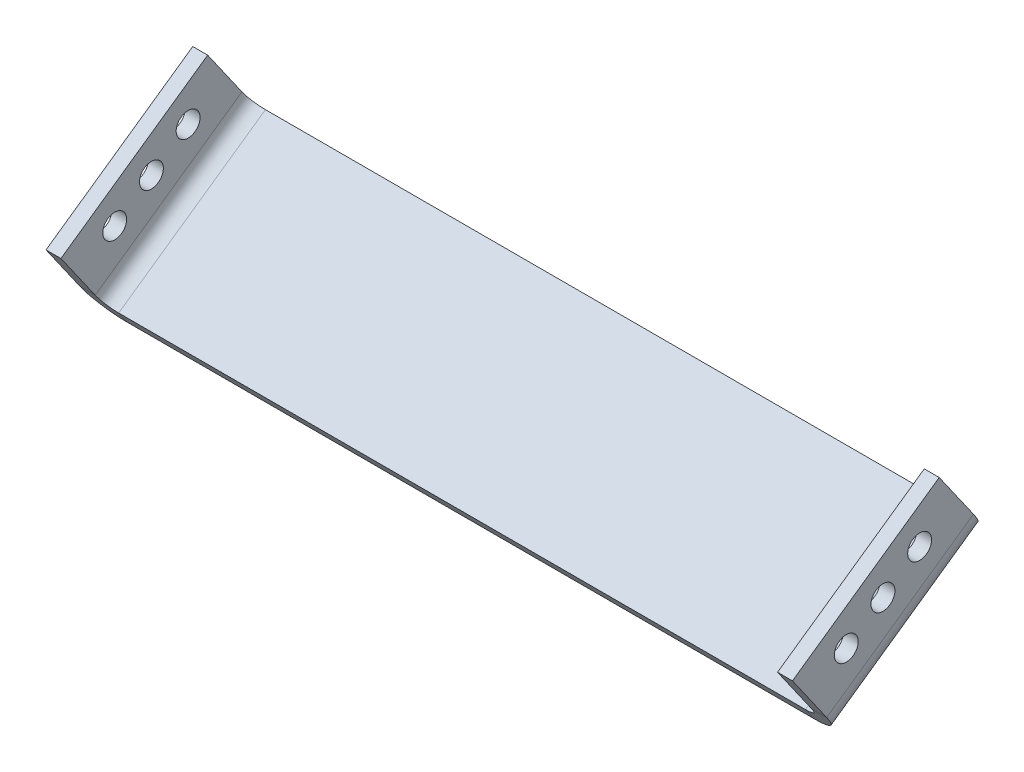
ISO-10303-21;
HEADER;
FILE_DESCRIPTION(('STEP AP214'),'2;1');
FILE_NAME('part.step','',(''),(''),'','','');
FILE_SCHEMA(('AUTOMOTIVE_DESIGN { 1 0 10303 214 1 1 1 1 }'));
ENDSEC;
DATA;
#1=APPLICATION_CONTEXT('core data for automotive mechanical design processes');
#2=APPLICATION_PROTOCOL_DEFINITION('international standard','automotive_design',2000,#1);
#3=PRODUCT_CONTEXT('',#1,'mechanical');
#4=PRODUCT('Part','Part','',(#3));
#5=PRODUCT_RELATED_PRODUCT_CATEGORY('part','',(#4));
#6=PRODUCT_DEFINITION_FORMATION('','',#4);
#7=PRODUCT_DEFINITION_CONTEXT('part definition',#1,'design');
#8=PRODUCT_DEFINITION('design','',#6,#7);
#9=PRODUCT_DEFINITION_SHAPE('','',#8);
#10=(LENGTH_UNIT() NAMED_UNIT(*) SI_UNIT(.MILLI.,.METRE.));
#11=(NAMED_UNIT(*) PLANE_ANGLE_UNIT() SI_UNIT($,.RADIAN.));
#12=(NAMED_UNIT(*) SI_UNIT($,.STERADIAN.) SOLID_ANGLE_UNIT());
#13=UNCERTAINTY_MEASURE_WITH_UNIT(LENGTH_MEASURE(1.E-05),#10,'distance_accuracy_value','');
#14=(GEOMETRIC_REPRESENTATION_CONTEXT(3) GLOBAL_UNCERTAINTY_ASSIGNED_CONTEXT((#13)) GLOBAL_UNIT_ASSIGNED_CONTEXT((#10,
#11,#12)) REPRESENTATION_CONTEXT('',''));
#15=CARTESIAN_POINT('',(0.,0.,0.));
#16=DIRECTION('',(0.,0.,1.));
#17=DIRECTION('',(1.,0.,0.));
#18=AXIS2_PLACEMENT_3D('',#15,#16,#17);
#19=CARTESIAN_POINT('',(158.75,76.8527751929984,82.6284773456917));
#20=DIRECTION('',(0.,0.819152044288992,0.573576436351046));
#21=DIRECTION('',(0.,0.573576436351046,-0.819152044288992));
#22=AXIS2_PLACEMENT_3D('',#19,#20,#21);
#23=PLANE('',#22);
#24=DIRECTION('',(0.,-0.573576436351046,0.819152044288992));
#25=VECTOR('',#24,1.);
#26=CARTESIAN_POINT('',(152.4,54.9995129680235,113.838170233102));
#27=LINE('',#26,#25);
#28=CARTESIAN_POINT('',(152.4,54.9995129680235,113.838170233102));
#29=VERTEX_POINT('',#28);
#30=CARTESIAN_POINT('',(152.4,76.8527751929984,82.6284773456917));
#31=VERTEX_POINT('',#30);
#32=EDGE_CURVE('E180',#29,#31,#27,.F.);
#33=ORIENTED_EDGE('',*,*,#32,.F.);
#34=DIRECTION('',(-1.,0.,0.));
#35=VECTOR('',#34,1.);
#36=CARTESIAN_POINT('',(158.75,54.9995129680235,113.838170233102));
#37=LINE('',#36,#35);
#38=CARTESIAN_POINT('',(6.34999999999999,54.9995129680235,113.838170233102));
#39=VERTEX_POINT('',#38);
#40=EDGE_CURVE('E48',#29,#39,#37,.T.);
#41=ORIENTED_EDGE('',*,*,#40,.T.);
#42=DIRECTION('',(0.,0.573576436351046,-0.819152044288992));
#43=VECTOR('',#42,1.);
#44=CARTESIAN_POINT('',(6.34999999999999,76.8527751929984,82.6284773456917));
#45=LINE('',#44,#43);
#46=CARTESIAN_POINT('',(6.34999999999999,76.8527751929984,82.6284773456917));
#47=VERTEX_POINT('',#46);
#48=EDGE_CURVE('E231',#47,#39,#45,.F.);
#49=ORIENTED_EDGE('',*,*,#48,.F.);
#50=DIRECTION('',(-1.,0.,0.));
#51=VECTOR('',#50,1.);
#52=CARTESIAN_POINT('',(158.75,76.8527751929984,82.6284773456917));
#53=LINE('',#52,#51);
#54=EDGE_CURVE('E11',#31,#47,#53,.T.);
#55=ORIENTED_EDGE('',*,*,#54,.F.);
#56=EDGE_LOOP('',(#33,#41,#49,#55));
#57=FACE_BOUND('',#56,.T.);
#58=ADVANCED_FACE('F39',(#57),#23,.F.);
#59=CARTESIAN_POINT('',(158.75,79.453582933616,84.4495825311063));
#60=DIRECTION('',(0.,0.819152044288992,0.573576436351046));
#61=DIRECTION('',(0.,0.573576436351046,-0.819152044288992));
#62=AXIS2_PLACEMENT_3D('',#59,#60,#61);
#63=PLANE('',#62);
#64=DIRECTION('',(1.,0.,0.));
#65=VECTOR('',#64,1.);
#66=CARTESIAN_POINT('',(158.75,79.453582933616,84.4495825311063));
#67=LINE('',#66,#65);
#68=CARTESIAN_POINT('',(152.4,79.4535829336159,84.4495825311062));
#69=VERTEX_POINT('',#68);
#70=CARTESIAN_POINT('',(6.34999999999999,79.453582933616,84.4495825311063));
#71=VERTEX_POINT('',#70);
#72=EDGE_CURVE('E250',#69,#71,#67,.F.);
#73=ORIENTED_EDGE('',*,*,#72,.T.);
#74=DIRECTION('',(0.,0.573576436351046,-0.819152044288992));
#75=VECTOR('',#74,1.);
#76=CARTESIAN_POINT('',(6.34999999999999,79.453582933616,84.4495825311063));
#77=LINE('',#76,#75);
#78=CARTESIAN_POINT('',(6.34999999999999,57.6003207086411,115.659275418517));
#79=VERTEX_POINT('',#78);
#80=EDGE_CURVE('E241',#71,#79,#77,.F.);
#81=ORIENTED_EDGE('',*,*,#80,.T.);
#82=DIRECTION('',(1.,0.,0.));
#83=VECTOR('',#82,1.);
#84=CARTESIAN_POINT('',(158.75,57.6003207086411,115.659275418517));
#85=LINE('',#84,#83);
#86=CARTESIAN_POINT('',(152.4,57.600320708641,115.659275418517));
#87=VERTEX_POINT('',#86);
#88=EDGE_CURVE('E247',#87,#79,#85,.F.);
#89=ORIENTED_EDGE('',*,*,#88,.F.);
#90=DIRECTION('',(0.,-0.573576436351046,0.819152044288992));
#91=VECTOR('',#90,1.);
#92=CARTESIAN_POINT('',(152.4,57.600320708641,115.659275418517));
#93=LINE('',#92,#91);
#94=EDGE_CURVE('E191',#87,#69,#93,.F.);
#95=ORIENTED_EDGE('',*,*,#94,.T.);
#96=EDGE_LOOP('',(#73,#81,#89,#95));
#97=FACE_BOUND('',#96,.T.);
#98=ADVANCED_FACE('F333',(#97),#63,.T.);
#99=CARTESIAN_POINT('',(158.75,54.9995129680235,113.838170233102));
#100=DIRECTION('',(0.,-0.573576436351046,0.819152044288992));
#101=DIRECTION('',(-1.,0.,0.));
#102=AXIS2_PLACEMENT_3D('',#99,#100,#101);
#103=PLANE('',#102);
#104=ORIENTED_EDGE('',*,*,#88,.T.);
#105=DIRECTION('',(0.,-0.819152044288989,-0.573576436351051));
#106=VECTOR('',#105,1.);
#107=CARTESIAN_POINT('',(6.34999999999999,57.6003207086411,115.659275418517));
#108=LINE('',#107,#106);
#109=EDGE_CURVE('E245',#79,#39,#108,.T.);
#110=ORIENTED_EDGE('',*,*,#109,.T.);
#111=ORIENTED_EDGE('',*,*,#40,.F.);
#112=DIRECTION('',(0.,-0.819152044288991,-0.573576436351046));
#113=VECTOR('',#112,1.);
#114=CARTESIAN_POINT('',(152.4,57.600320708641,115.659275418517));
#115=LINE('',#114,#113);
#116=EDGE_CURVE('E186',#87,#29,#115,.T.);
#117=ORIENTED_EDGE('',*,*,#116,.F.);
#118=EDGE_LOOP('',(#104,#110,#111,#117));
#119=FACE_BOUND('',#118,.T.);
#120=ADVANCED_FACE('F41',(#119),#103,.T.);
#121=CARTESIAN_POINT('',(158.75,76.8527751929984,82.6284773456917));
#122=DIRECTION('',(0.,-0.573576436351046,0.819152044288992));
#123=DIRECTION('',(-1.,0.,0.));
#124=AXIS2_PLACEMENT_3D('',#121,#122,#123);
#125=PLANE('',#124);
#126=DIRECTION('',(0.,-0.819152044288992,-0.573576436351046));
#127=VECTOR('',#126,1.);
#128=CARTESIAN_POINT('',(152.4,79.4535829336159,84.4495825311062));
#129=LINE('',#128,#127);
#130=EDGE_CURVE('E195',#69,#31,#129,.T.);
#131=ORIENTED_EDGE('',*,*,#130,.T.);
#132=ORIENTED_EDGE('',*,*,#54,.T.);
#133=DIRECTION('',(0.,-0.819152044288992,-0.573576436351046));
#134=VECTOR('',#133,1.);
#135=CARTESIAN_POINT('',(6.34999999999999,79.4535829336159,84.4495825311063));
#136=LINE('',#135,#134);
#137=EDGE_CURVE('E236',#71,#47,#136,.T.);
#138=ORIENTED_EDGE('',*,*,#137,.F.);
#139=ORIENTED_EDGE('',*,*,#72,.F.);
#140=EDGE_LOOP('',(#131,#132,#138,#139));
#141=FACE_BOUND('',#140,.T.);
#142=ADVANCED_FACE('F323',(#141),#125,.F.);
#143=CARTESIAN_POINT('',(6.34999999999999,60.2011284492586,117.480380603931));
#144=DIRECTION('',(0.,-0.573576436351046,0.819152044288992));
#145=DIRECTION('',(0.,0.819152044288992,0.573576436351046));
#146=AXIS2_PLACEMENT_3D('',#143,#144,#145);
#147=PLANE('',#146);
#148=DIRECTION('',(1.,0.,0.));
#149=VECTOR('',#148,1.);
#150=CARTESIAN_POINT('',(0.,60.2011284492586,117.480380603931));
#151=LINE('',#150,#149);
#152=CARTESIAN_POINT('',(3.17499999999999,60.2011284492586,117.480380603931));
#153=VERTEX_POINT('',#152);
#154=CARTESIAN_POINT('',(0.,60.2011284492586,117.480380603931));
#155=VERTEX_POINT('',#154);
#156=EDGE_CURVE('E198',#153,#155,#151,.F.);
#157=ORIENTED_EDGE('',*,*,#156,.T.);
#158=CARTESIAN_POINT('',(6.34999999999999,60.2011284492586,117.480380603931));
#159=DIRECTION('',(0.,-0.573576436351046,0.819152044288992));
#160=DIRECTION('',(0.,-0.819152044288992,-0.573576436351046));
#161=AXIS2_PLACEMENT_3D('',#158,#159,#160);
#162=CIRCLE('',#161,6.35);
#163=EDGE_CURVE('E64',#39,#155,#162,.F.);
#164=ORIENTED_EDGE('',*,*,#163,.F.);
#165=ORIENTED_EDGE('',*,*,#109,.F.);
#166=CARTESIAN_POINT('',(6.34999999999999,60.2011284492586,117.480380603931));
#167=DIRECTION('',(0.,-0.573576436351046,0.819152044288992));
#168=DIRECTION('',(0.,-0.819152044288992,-0.573576436351046));
#169=AXIS2_PLACEMENT_3D('',#166,#167,#168);
#170=CIRCLE('',#169,3.175);
#171=EDGE_CURVE('E238',#79,#153,#170,.F.);
#172=ORIENTED_EDGE('',*,*,#171,.T.);
#173=EDGE_LOOP('',(#157,#164,#165,#172));
#174=FACE_BOUND('',#173,.T.);
#175=ADVANCED_FACE('F309',(#174),#147,.T.);
#176=CARTESIAN_POINT('',(6.34999999999999,82.0543906742335,86.2706877165209));
#177=DIRECTION('',(0.,-0.573576436351046,0.819152044288992));
#178=DIRECTION('',(0.,0.819152044288992,0.573576436351046));
#179=AXIS2_PLACEMENT_3D('',#176,#177,#178);
#180=PLANE('',#179);
#181=CARTESIAN_POINT('',(6.34999999999999,82.0543906742335,86.2706877165209));
#182=DIRECTION('',(0.,-0.573576436351046,0.819152044288992));
#183=DIRECTION('',(0.,-0.819152044288992,-0.573576436351046));
#184=AXIS2_PLACEMENT_3D('',#181,#182,#183);
#185=CIRCLE('',#184,3.175);
#186=CARTESIAN_POINT('',(3.17499999999999,82.0543906742335,86.2706877165209));
#187=VERTEX_POINT('',#186);
#188=EDGE_CURVE('E56',#187,#71,#185,.T.);
#189=ORIENTED_EDGE('',*,*,#188,.T.);
#190=ORIENTED_EDGE('',*,*,#137,.T.);
#191=CARTESIAN_POINT('',(6.34999999999999,82.0543906742335,86.2706877165209));
#192=DIRECTION('',(0.,-0.573576436351046,0.819152044288992));
#193=DIRECTION('',(0.,-0.819152044288992,-0.573576436351046));
#194=AXIS2_PLACEMENT_3D('',#191,#192,#193);
#195=CIRCLE('',#194,6.35);
#196=CARTESIAN_POINT('',(0.,82.0543906742335,86.2706877165209));
#197=VERTEX_POINT('',#196);
#198=EDGE_CURVE('E234',#197,#47,#195,.T.);
#199=ORIENTED_EDGE('',*,*,#198,.F.);
#200=DIRECTION('',(1.,0.,0.));
#201=VECTOR('',#200,1.);
#202=CARTESIAN_POINT('',(3.17499999999999,82.0543906742335,86.2706877165209));
#203=LINE('',#202,#201);
#204=EDGE_CURVE('E224',#187,#197,#203,.F.);
#205=ORIENTED_EDGE('',*,*,#204,.F.);
#206=EDGE_LOOP('',(#189,#190,#199,#205));
#207=FACE_BOUND('',#206,.T.);
#208=ADVANCED_FACE('F318',(#207),#180,.F.);
#209=CARTESIAN_POINT('',(6.34999999999999,82.0543906742335,86.2706877165208));
#210=DIRECTION('',(0.,0.573576436351046,-0.819152044288992));
#211=DIRECTION('',(-1.,0.,0.));
#212=AXIS2_PLACEMENT_3D('',#209,#210,#211);
#213=CYLINDRICAL_SURFACE('',#212,6.35);
#214=ORIENTED_EDGE('',*,*,#48,.T.);
#215=ORIENTED_EDGE('',*,*,#163,.T.);
#216=DIRECTION('',(0.,0.573576436351047,-0.819152044288991));
#217=VECTOR('',#216,1.);
#218=CARTESIAN_POINT('',(0.,60.2011284492586,117.480380603931));
#219=LINE('',#218,#217);
#220=EDGE_CURVE('E221',#197,#155,#219,.F.);
#221=ORIENTED_EDGE('',*,*,#220,.F.);
#222=ORIENTED_EDGE('',*,*,#198,.T.);
#223=EDGE_LOOP('',(#214,#215,#221,#222));
#224=FACE_BOUND('',#223,.T.);
#225=ADVANCED_FACE('F306',(#224),#213,.T.);
#226=CARTESIAN_POINT('',(6.34999999999999,82.0543906742335,86.2706877165208));
#227=DIRECTION('',(0.,0.573576436351046,-0.819152044288992));
#228=DIRECTION('',(-1.,0.,0.));
#229=AXIS2_PLACEMENT_3D('',#226,#227,#228);
#230=CYLINDRICAL_SURFACE('',#229,3.175);
#231=ORIENTED_EDGE('',*,*,#80,.F.);
#232=ORIENTED_EDGE('',*,*,#188,.F.);
#233=DIRECTION('',(0.,0.573576436351047,-0.819152044288991));
#234=VECTOR('',#233,1.);
#235=CARTESIAN_POINT('',(3.17499999999999,60.2011284492586,117.480380603931));
#236=LINE('',#235,#234);
#237=EDGE_CURVE('E227',#153,#187,#236,.T.);
#238=ORIENTED_EDGE('',*,*,#237,.F.);
#239=ORIENTED_EDGE('',*,*,#171,.F.);
#240=EDGE_LOOP('',(#231,#232,#238,#239));
#241=FACE_BOUND('',#240,.T.);
#242=ADVANCED_FACE('F335',(#241),#230,.F.);
#243=CARTESIAN_POINT('',(0.,92.4576216367036,93.5551084581792));
#244=DIRECTION('',(0.,-0.573576436351051,0.819152044288988));
#245=DIRECTION('',(0.,0.819152044288988,0.573576436351051));
#246=AXIS2_PLACEMENT_3D('',#243,#244,#245);
#247=PLANE('',#246);
#248=ORIENTED_EDGE('',*,*,#204,.T.);
#249=DIRECTION('',(0.,0.819152044288988,0.573576436351051));
#250=VECTOR('',#249,1.);
#251=CARTESIAN_POINT('',(3.98552718605672E-13,-13.5388962110039,19.3355476372333));
#252=LINE('',#251,#250);
#253=CARTESIAN_POINT('',(0.,92.4576216367036,93.5551084581792));
#254=VERTEX_POINT('',#253);
#255=EDGE_CURVE('E211',#197,#254,#252,.T.);
#256=ORIENTED_EDGE('',*,*,#255,.T.);
#257=DIRECTION('',(1.,0.,0.));
#258=VECTOR('',#257,1.);
#259=CARTESIAN_POINT('',(0.,92.4576216367036,93.5551084581792));
#260=LINE('',#259,#258);
#261=CARTESIAN_POINT('',(3.17499999999994,92.4576216367036,93.5551084581792));
#262=VERTEX_POINT('',#261);
#263=EDGE_CURVE('E201',#254,#262,#260,.T.);
#264=ORIENTED_EDGE('',*,*,#263,.T.);
#265=DIRECTION('',(0.,-0.819152044288988,-0.573576436351051));
#266=VECTOR('',#265,1.);
#267=CARTESIAN_POINT('',(3.17499999999994,92.4576216367036,93.5551084581792));
#268=LINE('',#267,#266);
#269=EDGE_CURVE('E218',#187,#262,#268,.F.);
#270=ORIENTED_EDGE('',*,*,#269,.F.);
#271=EDGE_LOOP('',(#248,#256,#264,#270));
#272=FACE_BOUND('',#271,.T.);
#273=ADVANCED_FACE('F316',(#272),#247,.F.);
#274=CARTESIAN_POINT('',(0.,57.6003207086411,115.659275418517));
#275=DIRECTION('',(0.,0.573576436351052,-0.819152044288987));
#276=DIRECTION('',(0.,-0.819152044288988,-0.573576436351052));
#277=AXIS2_PLACEMENT_3D('',#274,#275,#276);
#278=PLANE('',#277);
#279=ORIENTED_EDGE('',*,*,#156,.F.);
#280=DIRECTION('',(0.,0.819152044288988,0.573576436351052));
#281=VECTOR('',#280,1.);
#282=CARTESIAN_POINT('',(3.175,57.6003207086411,115.659275418517));
#283=LINE('',#282,#281);
#284=CARTESIAN_POINT('',(3.17499999999994,70.6043594117288,124.76480134559));
#285=VERTEX_POINT('',#284);
#286=EDGE_CURVE('E214',#285,#153,#283,.F.);
#287=ORIENTED_EDGE('',*,*,#286,.F.);
#288=DIRECTION('',(1.,0.,0.));
#289=VECTOR('',#288,1.);
#290=CARTESIAN_POINT('',(0.,70.6043594117288,124.76480134559));
#291=LINE('',#290,#289);
#292=CARTESIAN_POINT('',(0.,70.6043594117288,124.76480134559));
#293=VERTEX_POINT('',#292);
#294=EDGE_CURVE('E204',#293,#285,#291,.T.);
#295=ORIENTED_EDGE('',*,*,#294,.F.);
#296=DIRECTION('',(0.,-0.819152044288988,-0.573576436351052));
#297=VECTOR('',#296,1.);
#298=CARTESIAN_POINT('',(3.98552718605673E-13,-35.392158435979,50.5452405246437));
#299=LINE('',#298,#297);
#300=EDGE_CURVE('E207',#293,#155,#299,.T.);
#301=ORIENTED_EDGE('',*,*,#300,.T.);
#302=EDGE_LOOP('',(#279,#287,#295,#301));
#303=FACE_BOUND('',#302,.T.);
#304=ADVANCED_FACE('F299',(#303),#278,.F.);
#305=CARTESIAN_POINT('',(3.98552718605671E-13,0.,0.));
#306=DIRECTION('',(1.,0.,0.));
#307=DIRECTION('',(0.,1.,0.));
#308=AXIS2_PLACEMENT_3D('',#305,#306,#307);
#309=PLANE('',#308);
#310=CARTESIAN_POINT('',(-1.38777878078145E-13,76.3293750429818,105.517744531056));
#311=DIRECTION('',(-1.,0.,0.));
#312=DIRECTION('',(0.,1.,0.));
#313=AXIS2_PLACEMENT_3D('',#310,#311,#312);
#314=CIRCLE('',#313,2.53999999999999);
#315=CARTESIAN_POINT('',(-1.31502346396237E-13,78.8693750429818,105.517744531056));
#316=VERTEX_POINT('',#315);
#317=EDGE_CURVE('E651',#316,#316,#314,.T.);
#318=ORIENTED_EDGE('',*,*,#317,.F.);
#319=EDGE_LOOP('',(#318));
#320=FACE_BOUND('',#319,.T.);
#321=CARTESIAN_POINT('',(-1.38777878078145E-13,70.8660594867381,113.320167752908));
#322=DIRECTION('',(-1.,0.,0.));
#323=DIRECTION('',(0.,1.,0.));
#324=AXIS2_PLACEMENT_3D('',#321,#322,#323);
#325=CIRCLE('',#324,2.5400000000001);
#326=CARTESIAN_POINT('',(-1.31502346396237E-13,73.4060594867382,113.320167752908));
#327=VERTEX_POINT('',#326);
#328=EDGE_CURVE('E262',#327,#327,#325,.T.);
#329=ORIENTED_EDGE('',*,*,#328,.F.);
#330=EDGE_LOOP('',(#329));
#331=FACE_BOUND('',#330,.T.);
#332=CARTESIAN_POINT('',(-1.38777878078145E-13,81.7926905992255,97.7153213092031));
#333=DIRECTION('',(-1.,0.,0.));
#334=DIRECTION('',(0.,1.,0.));
#335=AXIS2_PLACEMENT_3D('',#332,#333,#334);
#336=CIRCLE('',#335,2.53999999999999);
#337=CARTESIAN_POINT('',(-1.31502346396237E-13,84.3326905992255,97.7153213092031));
#338=VERTEX_POINT('',#337);
#339=EDGE_CURVE('E258',#338,#338,#336,.T.);
#340=ORIENTED_EDGE('',*,*,#339,.F.);
#341=EDGE_LOOP('',(#340));
#342=FACE_BOUND('',#341,.T.);
#343=ORIENTED_EDGE('',*,*,#220,.T.);
#344=ORIENTED_EDGE('',*,*,#300,.F.);
#345=DIRECTION('',(0.,-0.573576436351046,0.819152044288992));
#346=VECTOR('',#345,1.);
#347=CARTESIAN_POINT('',(0.,105.996517847708,74.2195608209452));
#348=LINE('',#347,#346);
#349=EDGE_CURVE('E209',#254,#293,#348,.T.);
#350=ORIENTED_EDGE('',*,*,#349,.F.);
#351=ORIENTED_EDGE('',*,*,#255,.F.);
#352=EDGE_LOOP('',(#343,#344,#350,#351));
#353=FACE_BOUND('',#352,.T.);
#354=ADVANCED_FACE('F296',(#320,#331,#342,#353),#309,.F.);
#355=CARTESIAN_POINT('',(3.1750000000004,0.,0.));
#356=DIRECTION('',(1.,0.,0.));
#357=DIRECTION('',(0.,1.,0.));
#358=AXIS2_PLACEMENT_3D('',#355,#356,#357);
#359=PLANE('',#358);
#360=CARTESIAN_POINT('',(3.17499999999997,76.3293750429818,105.517744531056));
#361=DIRECTION('',(-1.,0.,0.));
#362=DIRECTION('',(0.,1.,0.));
#363=AXIS2_PLACEMENT_3D('',#360,#361,#362);
#364=CIRCLE('',#363,2.53999999999999);
#365=CARTESIAN_POINT('',(3.17499999999996,78.8693750429817,105.517744531056));
#366=VERTEX_POINT('',#365);
#367=EDGE_CURVE('E274',#366,#366,#364,.T.);
#368=ORIENTED_EDGE('',*,*,#367,.T.);
#369=EDGE_LOOP('',(#368));
#370=FACE_BOUND('',#369,.T.);
#371=CARTESIAN_POINT('',(3.17499999999997,70.8660594867381,113.320167752908));
#372=DIRECTION('',(-1.,0.,0.));
#373=DIRECTION('',(0.,1.,0.));
#374=AXIS2_PLACEMENT_3D('',#371,#372,#373);
#375=CIRCLE('',#374,2.5400000000001);
#376=CARTESIAN_POINT('',(3.17499999999996,73.4060594867382,113.320167752908));
#377=VERTEX_POINT('',#376);
#378=EDGE_CURVE('E261',#377,#377,#375,.T.);
#379=ORIENTED_EDGE('',*,*,#378,.T.);
#380=EDGE_LOOP('',(#379));
#381=FACE_BOUND('',#380,.T.);
#382=CARTESIAN_POINT('',(3.17499999999997,81.7926905992255,97.7153213092031));
#383=DIRECTION('',(-1.,0.,0.));
#384=DIRECTION('',(0.,1.,0.));
#385=AXIS2_PLACEMENT_3D('',#382,#383,#384);
#386=CIRCLE('',#385,2.53999999999999);
#387=CARTESIAN_POINT('',(3.17499999999996,84.3326905992255,97.7153213092031));
#388=VERTEX_POINT('',#387);
#389=EDGE_CURVE('E179',#388,#388,#386,.T.);
#390=ORIENTED_EDGE('',*,*,#389,.T.);
#391=EDGE_LOOP('',(#390));
#392=FACE_BOUND('',#391,.T.);
#393=ORIENTED_EDGE('',*,*,#269,.T.);
#394=DIRECTION('',(0.,0.573576436351046,-0.819152044288992));
#395=VECTOR('',#394,1.);
#396=CARTESIAN_POINT('',(3.17499999999994,70.6043594117288,124.76480134559));
#397=LINE('',#396,#395);
#398=EDGE_CURVE('E216',#262,#285,#397,.F.);
#399=ORIENTED_EDGE('',*,*,#398,.T.);
#400=ORIENTED_EDGE('',*,*,#286,.T.);
#401=ORIENTED_EDGE('',*,*,#237,.T.);
#402=EDGE_LOOP('',(#393,#399,#400,#401));
#403=FACE_BOUND('',#402,.T.);
#404=ADVANCED_FACE('F285',(#370,#381,#392,#403),#359,.T.);
#405=CARTESIAN_POINT('',(0.,70.6043594117288,124.76480134559));
#406=DIRECTION('',(0.,-0.819152044288992,-0.573576436351046));
#407=DIRECTION('',(0.,-0.573576436351046,0.819152044288992));
#408=AXIS2_PLACEMENT_3D('',#405,#406,#407);
#409=PLANE('',#408);
#410=ORIENTED_EDGE('',*,*,#398,.F.);
#411=ORIENTED_EDGE('',*,*,#263,.F.);
#412=ORIENTED_EDGE('',*,*,#349,.T.);
#413=ORIENTED_EDGE('',*,*,#294,.T.);
#414=EDGE_LOOP('',(#410,#411,#412,#413));
#415=FACE_BOUND('',#414,.T.);
#416=ADVANCED_FACE('F313',(#415),#409,.F.);
#417=CARTESIAN_POINT('',(152.4,82.0543906742335,86.2706877165208));
#418=DIRECTION('',(0.,0.573576436351046,-0.819152044288992));
#419=DIRECTION('',(0.,-0.819152044288992,-0.573576436351046));
#420=AXIS2_PLACEMENT_3D('',#417,#418,#419);
#421=PLANE('',#420);
#422=DIRECTION('',(-1.,0.,0.));
#423=VECTOR('',#422,1.);
#424=CARTESIAN_POINT('',(158.75,82.0543906742334,86.2706877165209));
#425=LINE('',#424,#423);
#426=CARTESIAN_POINT('',(155.575,82.0543906742335,86.2706877165208));
#427=VERTEX_POINT('',#426);
#428=CARTESIAN_POINT('',(158.75,82.0543906742335,86.2706877165208));
#429=VERTEX_POINT('',#428);
#430=EDGE_CURVE('E176',#427,#429,#425,.F.);
#431=ORIENTED_EDGE('',*,*,#430,.T.);
#432=CARTESIAN_POINT('',(152.4,82.0543906742335,86.2706877165208));
#433=DIRECTION('',(0.,0.573576436351046,-0.819152044288992));
#434=DIRECTION('',(0.,0.819152044288992,0.573576436351046));
#435=AXIS2_PLACEMENT_3D('',#432,#433,#434);
#436=CIRCLE('',#435,6.35000000000001);
#437=EDGE_CURVE('E183',#31,#429,#436,.F.);
#438=ORIENTED_EDGE('',*,*,#437,.F.);
#439=ORIENTED_EDGE('',*,*,#130,.F.);
#440=CARTESIAN_POINT('',(152.4,82.0543906742335,86.2706877165208));
#441=DIRECTION('',(0.,0.573576436351046,-0.819152044288992));
#442=DIRECTION('',(0.,0.819152044288992,0.573576436351046));
#443=AXIS2_PLACEMENT_3D('',#440,#441,#442);
#444=CIRCLE('',#443,3.17500000000001);
#445=EDGE_CURVE('E188',#69,#427,#444,.F.);
#446=ORIENTED_EDGE('',*,*,#445,.T.);
#447=EDGE_LOOP('',(#431,#438,#439,#446));
#448=FACE_BOUND('',#447,.T.);
#449=ADVANCED_FACE('F343',(#448),#421,.T.);
#450=CARTESIAN_POINT('',(152.4,60.2011284492586,117.480380603931));
#451=DIRECTION('',(0.,0.573576436351046,-0.819152044288992));
#452=DIRECTION('',(0.,-0.819152044288992,-0.573576436351046));
#453=AXIS2_PLACEMENT_3D('',#450,#451,#452);
#454=PLANE('',#453);
#455=CARTESIAN_POINT('',(152.4,60.2011284492586,117.480380603931));
#456=DIRECTION('',(0.,0.573576436351046,-0.819152044288992));
#457=DIRECTION('',(0.,0.819152044288992,0.573576436351046));
#458=AXIS2_PLACEMENT_3D('',#455,#456,#457);
#459=CIRCLE('',#458,3.17500000000001);
#460=CARTESIAN_POINT('',(155.575,60.2011284492586,117.480380603931));
#461=VERTEX_POINT('',#460);
#462=EDGE_CURVE('E159',#461,#87,#459,.T.);
#463=ORIENTED_EDGE('',*,*,#462,.T.);
#464=ORIENTED_EDGE('',*,*,#116,.T.);
#465=CARTESIAN_POINT('',(152.4,60.2011284492586,117.480380603931));
#466=DIRECTION('',(0.,0.573576436351046,-0.819152044288992));
#467=DIRECTION('',(0.,0.819152044288992,0.573576436351046));
#468=AXIS2_PLACEMENT_3D('',#465,#466,#467);
#469=CIRCLE('',#468,6.35000000000001);
#470=CARTESIAN_POINT('',(158.75,60.2011284492586,117.480380603931));
#471=VERTEX_POINT('',#470);
#472=EDGE_CURVE('E184',#471,#29,#469,.T.);
#473=ORIENTED_EDGE('',*,*,#472,.F.);
#474=DIRECTION('',(-1.,0.,0.));
#475=VECTOR('',#474,1.);
#476=CARTESIAN_POINT('',(155.575,60.2011284492586,117.480380603931));
#477=LINE('',#476,#475);
#478=EDGE_CURVE('E170',#461,#471,#477,.F.);
#479=ORIENTED_EDGE('',*,*,#478,.F.);
#480=EDGE_LOOP('',(#463,#464,#473,#479));
#481=FACE_BOUND('',#480,.T.);
#482=ADVANCED_FACE('F460',(#481),#454,.F.);
#483=CARTESIAN_POINT('',(152.4,60.2011284492586,117.480380603931));
#484=DIRECTION('',(0.,-0.573576436351046,0.819152044288992));
#485=DIRECTION('',(1.,0.,0.));
#486=AXIS2_PLACEMENT_3D('',#483,#484,#485);
#487=CYLINDRICAL_SURFACE('',#486,6.35000000000001);
#488=ORIENTED_EDGE('',*,*,#32,.T.);
#489=ORIENTED_EDGE('',*,*,#437,.T.);
#490=DIRECTION('',(0.,-0.573576436351046,0.819152044288991));
#491=VECTOR('',#490,1.);
#492=CARTESIAN_POINT('',(158.75,82.0543906742334,86.2706877165209));
#493=LINE('',#492,#491);
#494=EDGE_CURVE('E150',#471,#429,#493,.F.);
#495=ORIENTED_EDGE('',*,*,#494,.F.);
#496=ORIENTED_EDGE('',*,*,#472,.T.);
#497=EDGE_LOOP('',(#488,#489,#495,#496));
#498=FACE_BOUND('',#497,.T.);
#499=ADVANCED_FACE('F470',(#498),#487,.T.);
#500=CARTESIAN_POINT('',(152.4,60.2011284492586,117.480380603931));
#501=DIRECTION('',(0.,-0.573576436351046,0.819152044288992));
#502=DIRECTION('',(1.,0.,0.));
#503=AXIS2_PLACEMENT_3D('',#500,#501,#502);
#504=CYLINDRICAL_SURFACE('',#503,3.17500000000001);
#505=ORIENTED_EDGE('',*,*,#94,.F.);
#506=ORIENTED_EDGE('',*,*,#462,.F.);
#507=DIRECTION('',(0.,-0.573576436351046,0.819152044288991));
#508=VECTOR('',#507,1.);
#509=CARTESIAN_POINT('',(155.575,82.0543906742335,86.2706877165209));
#510=LINE('',#509,#508);
#511=EDGE_CURVE('E173',#427,#461,#510,.T.);
#512=ORIENTED_EDGE('',*,*,#511,.F.);
#513=ORIENTED_EDGE('',*,*,#445,.F.);
#514=EDGE_LOOP('',(#505,#506,#512,#513));
#515=FACE_BOUND('',#514,.T.);
#516=ADVANCED_FACE('F480',(#515),#504,.F.);
#517=CARTESIAN_POINT('',(158.75,79.4535829336159,84.4495825311063));
#518=DIRECTION('',(0.,-0.573576436351052,0.819152044288987));
#519=DIRECTION('',(0.,0.819152044288988,0.573576436351052));
#520=AXIS2_PLACEMENT_3D('',#517,#518,#519);
#521=PLANE('',#520);
#522=ORIENTED_EDGE('',*,*,#430,.F.);
#523=DIRECTION('',(0.,0.819152044288988,0.573576436351052));
#524=VECTOR('',#523,1.);
#525=CARTESIAN_POINT('',(155.575,79.453582933616,84.4495825311063));
#526=LINE('',#525,#524);
#527=CARTESIAN_POINT('',(155.575,92.4576216367036,93.5551084581792));
#528=VERTEX_POINT('',#527);
#529=EDGE_CURVE('E157',#528,#427,#526,.F.);
#530=ORIENTED_EDGE('',*,*,#529,.F.);
#531=DIRECTION('',(-1.,0.,0.));
#532=VECTOR('',#531,1.);
#533=CARTESIAN_POINT('',(158.75,92.4576216367036,93.5551084581792));
#534=LINE('',#533,#532);
#535=CARTESIAN_POINT('',(158.75,92.4576216367036,93.5551084581792));
#536=VERTEX_POINT('',#535);
#537=EDGE_CURVE('E138',#536,#528,#534,.T.);
#538=ORIENTED_EDGE('',*,*,#537,.F.);
#539=DIRECTION('',(0.,-0.819152044288988,-0.573576436351052));
#540=VECTOR('',#539,1.);
#541=CARTESIAN_POINT('',(158.75,-13.5388962110043,19.3355476372329));
#542=LINE('',#541,#540);
#543=EDGE_CURVE('E147',#536,#429,#542,.T.);
#544=ORIENTED_EDGE('',*,*,#543,.T.);
#545=EDGE_LOOP('',(#522,#530,#538,#544));
#546=FACE_BOUND('',#545,.T.);
#547=ADVANCED_FACE('F156',(#546),#521,.F.);
#548=CARTESIAN_POINT('',(158.75,70.6043594117288,124.76480134559));
#549=DIRECTION('',(0.,0.573576436351052,-0.819152044288987));
#550=DIRECTION('',(0.,-0.819152044288988,-0.573576436351052));
#551=AXIS2_PLACEMENT_3D('',#548,#549,#550);
#552=PLANE('',#551);
#553=ORIENTED_EDGE('',*,*,#478,.T.);
#554=DIRECTION('',(0.,0.819152044288988,0.573576436351052));
#555=VECTOR('',#554,1.);
#556=CARTESIAN_POINT('',(158.75,-35.3921584359794,50.5452405246433));
#557=LINE('',#556,#555);
#558=CARTESIAN_POINT('',(158.75,70.6043594117288,124.76480134559));
#559=VERTEX_POINT('',#558);
#560=EDGE_CURVE('E144',#471,#559,#557,.T.);
#561=ORIENTED_EDGE('',*,*,#560,.T.);
#562=DIRECTION('',(-1.,0.,0.));
#563=VECTOR('',#562,1.);
#564=CARTESIAN_POINT('',(158.75,70.6043594117288,124.76480134559));
#565=LINE('',#564,#563);
#566=CARTESIAN_POINT('',(155.575,70.6043594117288,124.76480134559));
#567=VERTEX_POINT('',#566);
#568=EDGE_CURVE('E141',#559,#567,#565,.T.);
#569=ORIENTED_EDGE('',*,*,#568,.T.);
#570=DIRECTION('',(0.,-0.819152044288988,-0.573576436351052));
#571=VECTOR('',#570,1.);
#572=CARTESIAN_POINT('',(155.575,70.6043594117288,124.76480134559));
#573=LINE('',#572,#571);
#574=EDGE_CURVE('E165',#461,#567,#573,.F.);
#575=ORIENTED_EDGE('',*,*,#574,.F.);
#576=EDGE_LOOP('',(#553,#561,#569,#575));
#577=FACE_BOUND('',#576,.T.);
#578=ADVANCED_FACE('F584',(#577),#552,.F.);
#579=CARTESIAN_POINT('',(158.75,-4.63851603738037E-13,-3.24792389548037E-13));
#580=DIRECTION('',(-1.,0.,0.));
#581=DIRECTION('',(0.,-1.,0.));
#582=AXIS2_PLACEMENT_3D('',#579,#580,#581);
#583=PLANE('',#582);
#584=CARTESIAN_POINT('',(158.75,76.3293750429813,105.517744531055));
#585=DIRECTION('',(-1.,0.,0.));
#586=DIRECTION('',(0.,1.,0.));
#587=AXIS2_PLACEMENT_3D('',#584,#585,#586);
#588=CIRCLE('',#587,2.53999999999999);
#589=CARTESIAN_POINT('',(158.75,78.8693750429813,105.517744531055));
#590=VERTEX_POINT('',#589);
#591=EDGE_CURVE('E644',#590,#590,#588,.T.);
#592=ORIENTED_EDGE('',*,*,#591,.T.);
#593=EDGE_LOOP('',(#592));
#594=FACE_BOUND('',#593,.T.);
#595=CARTESIAN_POINT('',(158.75,70.8660594867376,113.320167752908));
#596=DIRECTION('',(-1.,0.,0.));
#597=DIRECTION('',(0.,1.,0.));
#598=AXIS2_PLACEMENT_3D('',#595,#596,#597);
#599=CIRCLE('',#598,2.5400000000001);
#600=CARTESIAN_POINT('',(158.75,73.4060594867377,113.320167752908));
#601=VERTEX_POINT('',#600);
#602=EDGE_CURVE('E269',#601,#601,#599,.T.);
#603=ORIENTED_EDGE('',*,*,#602,.T.);
#604=EDGE_LOOP('',(#603));
#605=FACE_BOUND('',#604,.T.);
#606=CARTESIAN_POINT('',(158.75,81.792690599225,97.7153213092028));
#607=DIRECTION('',(-1.,0.,0.));
#608=DIRECTION('',(0.,1.,0.));
#609=AXIS2_PLACEMENT_3D('',#606,#607,#608);
#610=CIRCLE('',#609,2.53999999999999);
#611=CARTESIAN_POINT('',(158.75,84.332690599225,97.7153213092028));
#612=VERTEX_POINT('',#611);
#613=EDGE_CURVE('E266',#612,#612,#610,.T.);
#614=ORIENTED_EDGE('',*,*,#613,.T.);
#615=EDGE_LOOP('',(#614));
#616=FACE_BOUND('',#615,.T.);
#617=ORIENTED_EDGE('',*,*,#494,.T.);
#618=ORIENTED_EDGE('',*,*,#543,.F.);
#619=DIRECTION('',(0.,0.573576436351046,-0.819152044288992));
#620=VECTOR('',#619,1.);
#621=CARTESIAN_POINT('',(158.75,105.996517847708,74.2195608209452));
#622=LINE('',#621,#620);
#623=EDGE_CURVE('E134',#559,#536,#622,.T.);
#624=ORIENTED_EDGE('',*,*,#623,.F.);
#625=ORIENTED_EDGE('',*,*,#560,.F.);
#626=EDGE_LOOP('',(#617,#618,#624,#625));
#627=FACE_BOUND('',#626,.T.);
#628=ADVANCED_FACE('F148',(#594,#605,#616,#627),#583,.F.);
#629=CARTESIAN_POINT('',(155.575,-4.547207301192E-13,-3.18398883009687E-13));
#630=DIRECTION('',(-1.,0.,0.));
#631=DIRECTION('',(0.,-1.,0.));
#632=AXIS2_PLACEMENT_3D('',#629,#630,#631);
#633=PLANE('',#632);
#634=CARTESIAN_POINT('',(155.575,76.3293750429813,105.517744531055));
#635=DIRECTION('',(1.,0.,0.));
#636=DIRECTION('',(0.,-1.,0.));
#637=AXIS2_PLACEMENT_3D('',#634,#635,#636);
#638=CIRCLE('',#637,2.53999999999999);
#639=CARTESIAN_POINT('',(155.575,73.7893750429813,105.517744531055));
#640=VERTEX_POINT('',#639);
#641=EDGE_CURVE('E43',#640,#640,#638,.T.);
#642=ORIENTED_EDGE('',*,*,#641,.T.);
#643=EDGE_LOOP('',(#642));
#644=FACE_BOUND('',#643,.T.);
#645=CARTESIAN_POINT('',(155.575,70.8660594867376,113.320167752908));
#646=DIRECTION('',(1.,0.,0.));
#647=DIRECTION('',(0.,-1.,0.));
#648=AXIS2_PLACEMENT_3D('',#645,#646,#647);
#649=CIRCLE('',#648,2.5400000000001);
#650=CARTESIAN_POINT('',(155.575,68.3260594867375,113.320167752908));
#651=VERTEX_POINT('',#650);
#652=EDGE_CURVE('E259',#651,#651,#649,.T.);
#653=ORIENTED_EDGE('',*,*,#652,.T.);
#654=EDGE_LOOP('',(#653));
#655=FACE_BOUND('',#654,.T.);
#656=CARTESIAN_POINT('',(155.575,81.792690599225,97.7153213092028));
#657=DIRECTION('',(1.,0.,0.));
#658=DIRECTION('',(0.,-1.,0.));
#659=AXIS2_PLACEMENT_3D('',#656,#657,#658);
#660=CIRCLE('',#659,2.53999999999999);
#661=CARTESIAN_POINT('',(155.575,79.252690599225,97.7153213092028));
#662=VERTEX_POINT('',#661);
#663=EDGE_CURVE('E256',#662,#662,#660,.T.);
#664=ORIENTED_EDGE('',*,*,#663,.T.);
#665=EDGE_LOOP('',(#664));
#666=FACE_BOUND('',#665,.T.);
#667=ORIENTED_EDGE('',*,*,#574,.T.);
#668=DIRECTION('',(0.,-0.573576436351046,0.819152044288992));
#669=VECTOR('',#668,1.);
#670=CARTESIAN_POINT('',(155.575,92.4576216367036,93.5551084581792));
#671=LINE('',#670,#669);
#672=EDGE_CURVE('E154',#567,#528,#671,.F.);
#673=ORIENTED_EDGE('',*,*,#672,.T.);
#674=ORIENTED_EDGE('',*,*,#529,.T.);
#675=ORIENTED_EDGE('',*,*,#511,.T.);
#676=EDGE_LOOP('',(#667,#673,#674,#675));
#677=FACE_BOUND('',#676,.T.);
#678=ADVANCED_FACE('F495',(#644,#655,#666,#677),#633,.T.);
#679=CARTESIAN_POINT('',(158.75,92.4576216367036,93.5551084581792));
#680=DIRECTION('',(0.,-0.819152044288992,-0.573576436351046));
#681=DIRECTION('',(0.,-0.573576436351046,0.819152044288992));
#682=AXIS2_PLACEMENT_3D('',#679,#680,#681);
#683=PLANE('',#682);
#684=ORIENTED_EDGE('',*,*,#672,.F.);
#685=ORIENTED_EDGE('',*,*,#568,.F.);
#686=ORIENTED_EDGE('',*,*,#623,.T.);
#687=ORIENTED_EDGE('',*,*,#537,.T.);
#688=EDGE_LOOP('',(#684,#685,#686,#687));
#689=FACE_BOUND('',#688,.T.);
#690=ADVANCED_FACE('F136',(#689),#683,.F.);
#691=CARTESIAN_POINT('',(-1.38777878078145E-13,81.7926905992255,97.7153213092031));
#692=DIRECTION('',(1.,0.,0.));
#693=DIRECTION('',(0.,1.,0.));
#694=AXIS2_PLACEMENT_3D('',#691,#692,#693);
#695=CYLINDRICAL_SURFACE('',#694,2.53999999999999);
#696=ORIENTED_EDGE('',*,*,#663,.F.);
#697=EDGE_LOOP('',(#696));
#698=FACE_BOUND('',#697,.T.);
#699=ORIENTED_EDGE('',*,*,#613,.F.);
#700=EDGE_LOOP('',(#699));
#701=FACE_BOUND('',#700,.T.);
#702=ADVANCED_FACE('F292',(#698,#701),#695,.F.);
#703=ORIENTED_EDGE('',*,*,#389,.F.);
#704=EDGE_LOOP('',(#703));
#705=FACE_BOUND('',#704,.T.);
#706=ORIENTED_EDGE('',*,*,#339,.T.);
#707=EDGE_LOOP('',(#706));
#708=FACE_BOUND('',#707,.T.);
#709=ADVANCED_FACE('F288',(#705,#708),#695,.F.);
#710=CARTESIAN_POINT('',(-1.38777878078145E-13,70.8660594867381,113.320167752908));
#711=DIRECTION('',(1.,0.,0.));
#712=DIRECTION('',(0.,1.,0.));
#713=AXIS2_PLACEMENT_3D('',#710,#711,#712);
#714=CYLINDRICAL_SURFACE('',#713,2.5400000000001);
#715=ORIENTED_EDGE('',*,*,#652,.F.);
#716=EDGE_LOOP('',(#715));
#717=FACE_BOUND('',#716,.T.);
#718=ORIENTED_EDGE('',*,*,#602,.F.);
#719=EDGE_LOOP('',(#718));
#720=FACE_BOUND('',#719,.T.);
#721=ADVANCED_FACE('F291',(#717,#720),#714,.F.);
#722=ORIENTED_EDGE('',*,*,#378,.F.);
#723=EDGE_LOOP('',(#722));
#724=FACE_BOUND('',#723,.T.);
#725=ORIENTED_EDGE('',*,*,#328,.T.);
#726=EDGE_LOOP('',(#725));
#727=FACE_BOUND('',#726,.T.);
#728=ADVANCED_FACE('F532',(#724,#727),#714,.F.);
#729=CARTESIAN_POINT('',(-1.38777878078145E-13,76.3293750429818,105.517744531056));
#730=DIRECTION('',(1.,0.,0.));
#731=DIRECTION('',(0.,1.,0.));
#732=AXIS2_PLACEMENT_3D('',#729,#730,#731);
#733=CYLINDRICAL_SURFACE('',#732,2.53999999999999);
#734=ORIENTED_EDGE('',*,*,#641,.F.);
#735=EDGE_LOOP('',(#734));
#736=FACE_BOUND('',#735,.T.);
#737=ORIENTED_EDGE('',*,*,#591,.F.);
#738=EDGE_LOOP('',(#737));
#739=FACE_BOUND('',#738,.T.);
#740=ADVANCED_FACE('F542',(#736,#739),#733,.F.);
#741=ORIENTED_EDGE('',*,*,#367,.F.);
#742=EDGE_LOOP('',(#741));
#743=FACE_BOUND('',#742,.T.);
#744=ORIENTED_EDGE('',*,*,#317,.T.);
#745=EDGE_LOOP('',(#744));
#746=FACE_BOUND('',#745,.T.);
#747=ADVANCED_FACE('F551',(#743,#746),#733,.F.);
#748=CLOSED_SHELL('',(#58,#98,#120,#142,#175,#208,#225,#242,#273,#304,#354,#404,#416,#449,#482,
#499,#516,#547,#578,#628,#678,#690,#702,#709,#721,#728,#740,#747));
#749=MANIFOLD_SOLID_BREP('B2',#748);
#750=ADVANCED_BREP_SHAPE_REPRESENTATION('',(#18,#749),#14);
#751=SHAPE_DEFINITION_REPRESENTATION(#9,#750);
ENDSEC;
END-ISO-10303-21;
